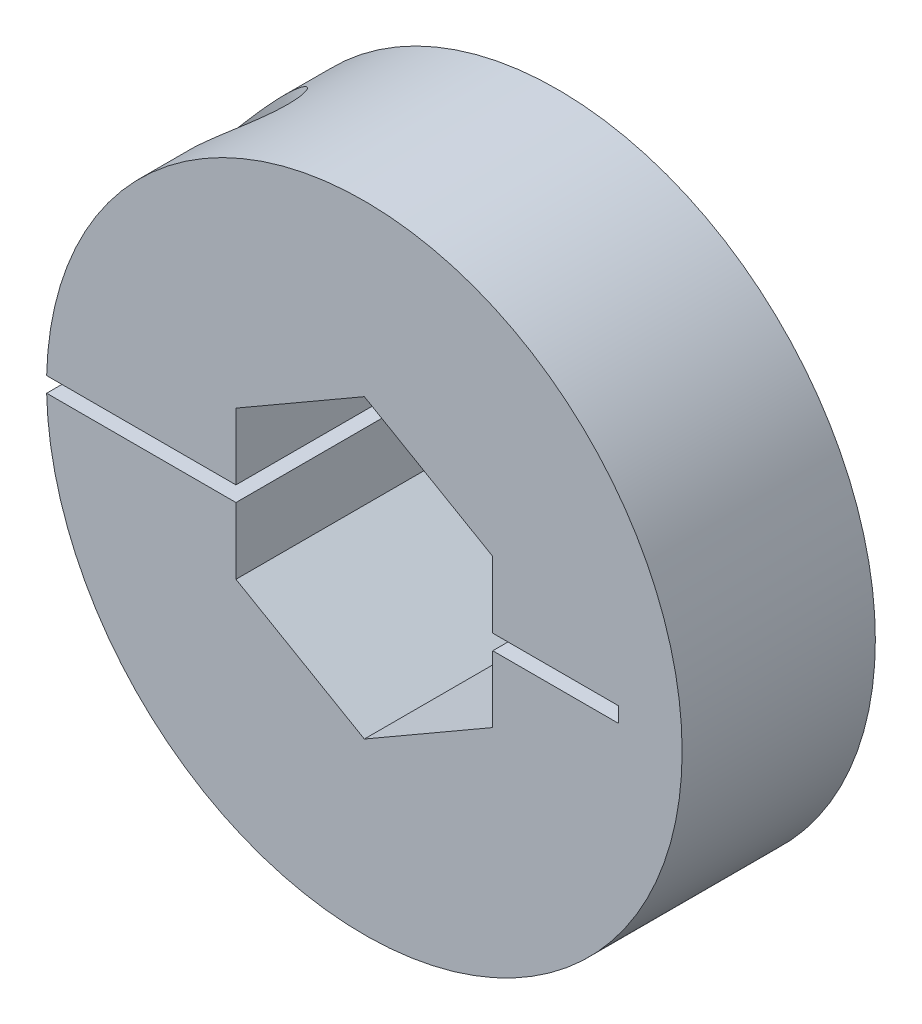
ISO-10303-21;
HEADER;
FILE_DESCRIPTION(('STEP AP214'),'2;1');
FILE_NAME('part.step','',(''),(''),'','','');
FILE_SCHEMA(('AUTOMOTIVE_DESIGN { 1 0 10303 214 1 1 1 1 }'));
ENDSEC;
DATA;
#1=APPLICATION_CONTEXT('core data for automotive mechanical design processes');
#2=APPLICATION_PROTOCOL_DEFINITION('international standard','automotive_design',2000,#1);
#3=PRODUCT_CONTEXT('',#1,'mechanical');
#4=PRODUCT('Part','Part','',(#3));
#5=PRODUCT_RELATED_PRODUCT_CATEGORY('part','',(#4));
#6=PRODUCT_DEFINITION_FORMATION('','',#4);
#7=PRODUCT_DEFINITION_CONTEXT('part definition',#1,'design');
#8=PRODUCT_DEFINITION('design','',#6,#7);
#9=PRODUCT_DEFINITION_SHAPE('','',#8);
#10=(LENGTH_UNIT() NAMED_UNIT(*) SI_UNIT(.MILLI.,.METRE.));
#11=(NAMED_UNIT(*) PLANE_ANGLE_UNIT() SI_UNIT($,.RADIAN.));
#12=(NAMED_UNIT(*) SI_UNIT($,.STERADIAN.) SOLID_ANGLE_UNIT());
#13=UNCERTAINTY_MEASURE_WITH_UNIT(LENGTH_MEASURE(1.E-05),#10,'distance_accuracy_value','');
#14=(GEOMETRIC_REPRESENTATION_CONTEXT(3) GLOBAL_UNCERTAINTY_ASSIGNED_CONTEXT((#13)) GLOBAL_UNIT_ASSIGNED_CONTEXT((#10,
#11,#12)) REPRESENTATION_CONTEXT('',''));
#15=CARTESIAN_POINT('',(0.,0.,0.));
#16=DIRECTION('',(0.,0.,1.));
#17=DIRECTION('',(1.,0.,0.));
#18=AXIS2_PLACEMENT_3D('',#15,#16,#17);
#19=CARTESIAN_POINT('',(6.4135,3.70283595144766,-4.826));
#20=DIRECTION('',(1.,0.,0.));
#21=DIRECTION('',(0.,1.,0.));
#22=AXIS2_PLACEMENT_3D('',#19,#20,#21);
#23=PLANE('',#22);
#24=DIRECTION('',(0.,1.,0.));
#25=VECTOR('',#24,1.);
#26=CARTESIAN_POINT('',(6.4135,3.70283595144766,4.826));
#27=LINE('',#26,#25);
#28=CARTESIAN_POINT('',(6.4135,-3.70283595144766,4.826));
#29=VERTEX_POINT('',#28);
#30=CARTESIAN_POINT('',(6.4135,-0.381,4.826));
#31=VERTEX_POINT('',#30);
#32=EDGE_CURVE('E220',#29,#31,#27,.T.);
#33=ORIENTED_EDGE('',*,*,#32,.T.);
#34=DIRECTION('',(0.,0.,-1.));
#35=VECTOR('',#34,1.);
#36=CARTESIAN_POINT('',(6.4135,-0.381,-4.826));
#37=LINE('',#36,#35);
#38=CARTESIAN_POINT('',(6.4135,-0.381,-4.826));
#39=VERTEX_POINT('',#38);
#40=EDGE_CURVE('E183',#31,#39,#37,.T.);
#41=ORIENTED_EDGE('',*,*,#40,.T.);
#42=DIRECTION('',(0.,1.,0.));
#43=VECTOR('',#42,1.);
#44=CARTESIAN_POINT('',(6.4135,3.70283595144766,-4.826));
#45=LINE('',#44,#43);
#46=CARTESIAN_POINT('',(6.4135,-3.70283595144766,-4.826));
#47=VERTEX_POINT('',#46);
#48=EDGE_CURVE('E202',#47,#39,#45,.T.);
#49=ORIENTED_EDGE('',*,*,#48,.F.);
#50=DIRECTION('',(0.,0.,1.));
#51=VECTOR('',#50,1.);
#52=CARTESIAN_POINT('',(6.4135,-3.70283595144766,-4.826));
#53=LINE('',#52,#51);
#54=EDGE_CURVE('E231',#47,#29,#53,.T.);
#55=ORIENTED_EDGE('',*,*,#54,.T.);
#56=EDGE_LOOP('',(#33,#41,#49,#55));
#57=FACE_BOUND('',#56,.T.);
#58=ADVANCED_FACE('F33',(#57),#23,.F.);
#59=CARTESIAN_POINT('',(-6.4135,3.70283595144767,-4.826));
#60=DIRECTION('',(-1.,0.,0.));
#61=DIRECTION('',(0.,0.,1.));
#62=AXIS2_PLACEMENT_3D('',#59,#60,#61);
#63=PLANE('',#62);
#64=DIRECTION('',(0.,-1.,0.));
#65=VECTOR('',#64,1.);
#66=CARTESIAN_POINT('',(-6.4135,3.70283595144767,-4.826));
#67=LINE('',#66,#65);
#68=CARTESIAN_POINT('',(-6.4135,-0.381,-4.826));
#69=VERTEX_POINT('',#68);
#70=CARTESIAN_POINT('',(-6.4135,-3.70283595144767,-4.826));
#71=VERTEX_POINT('',#70);
#72=EDGE_CURVE('E190',#69,#71,#67,.T.);
#73=ORIENTED_EDGE('',*,*,#72,.F.);
#74=DIRECTION('',(0.,0.,1.));
#75=VECTOR('',#74,1.);
#76=CARTESIAN_POINT('',(-6.4135,-0.381,-4.826));
#77=LINE('',#76,#75);
#78=CARTESIAN_POINT('',(-6.4135,-0.380999999999999,4.826));
#79=VERTEX_POINT('',#78);
#80=EDGE_CURVE('E11',#69,#79,#77,.T.);
#81=ORIENTED_EDGE('',*,*,#80,.T.);
#82=DIRECTION('',(0.,-1.,0.));
#83=VECTOR('',#82,1.);
#84=CARTESIAN_POINT('',(-6.4135,3.70283595144767,4.826));
#85=LINE('',#84,#83);
#86=CARTESIAN_POINT('',(-6.4135,-3.70283595144767,4.826));
#87=VERTEX_POINT('',#86);
#88=EDGE_CURVE('E209',#79,#87,#85,.T.);
#89=ORIENTED_EDGE('',*,*,#88,.T.);
#90=DIRECTION('',(0.,0.,1.));
#91=VECTOR('',#90,1.);
#92=CARTESIAN_POINT('',(-6.4135,-3.70283595144767,-4.826));
#93=LINE('',#92,#91);
#94=EDGE_CURVE('E235',#71,#87,#93,.T.);
#95=ORIENTED_EDGE('',*,*,#94,.F.);
#96=EDGE_LOOP('',(#73,#81,#89,#95));
#97=FACE_BOUND('',#96,.T.);
#98=ADVANCED_FACE('F268',(#97),#63,.F.);
#99=CARTESIAN_POINT('',(0.,0.,4.826));
#100=DIRECTION('',(0.,0.,-1.));
#101=DIRECTION('',(-1.,0.,0.));
#102=AXIS2_PLACEMENT_3D('',#99,#100,#101);
#103=CYLINDRICAL_SURFACE('',#102,15.875);
#104=CARTESIAN_POINT('',(-11.0444273414423,-11.4033437946771,2.3876));
#105=CARTESIAN_POINT('',(-10.8993451505357,-11.543860051548,2.3875989052676));
#106=CARTESIAN_POINT('',(-10.7515344815633,-11.6816220779077,2.37441386829305));
#107=CARTESIAN_POINT('',(-10.4538108643067,-11.9487784467251,2.31834079651535));
#108=CARTESIAN_POINT('',(-10.3038993530244,-12.078178198767,2.27547217874482));
#109=CARTESIAN_POINT('',(-10.0350643244456,-12.3019431103898,2.16764699043194));
#110=CARTESIAN_POINT('',(-9.91558653311282,-12.3983357041165,2.10831724106942));
#111=CARTESIAN_POINT('',(-9.68293808218132,-12.5808623037821,1.96608962689786));
#112=CARTESIAN_POINT('',(-9.56975996147336,-12.6670085888259,1.88322038373859));
#113=CARTESIAN_POINT('',(-9.37308449328351,-12.8130153213659,1.70923411588297));
#114=CARTESIAN_POINT('',(-9.2877914412731,-12.8748615574782,1.621825654732));
#115=CARTESIAN_POINT('',(-9.12899384516027,-12.987940296068,1.4307865709417));
#116=CARTESIAN_POINT('',(-9.05548644119453,-13.0391753742944,1.32715989585379));
#117=CARTESIAN_POINT('',(-8.92378937533684,-13.129663764886,1.10469067946461));
#118=CARTESIAN_POINT('',(-8.86570722780717,-13.168833267305,0.985749500272508));
#119=CARTESIAN_POINT('',(-8.76936362458115,-13.2331889273362,0.736558452506271));
#120=CARTESIAN_POINT('',(-8.73108873692553,-13.2583845619249,0.60631631765238));
#121=CARTESIAN_POINT('',(-8.68043699287462,-13.291592629371,0.355660762822259));
#122=CARTESIAN_POINT('',(-8.6654640321566,-13.3013305515726,0.235995044893112));
#123=CARTESIAN_POINT('',(-8.65380143935779,-13.3089220515833,-0.00457807721320276));
#124=CARTESIAN_POINT('',(-8.65710360499695,-13.3067809609545,-0.125484900037684));
#125=CARTESIAN_POINT('',(-8.68100163644235,-13.291200354001,-0.357182752312786));
#126=CARTESIAN_POINT('',(-8.70051380991413,-13.278468779643,-0.468136528045965));
#127=CARTESIAN_POINT('',(-8.75438596841741,-13.243012584924,-0.684684786263972));
#128=CARTESIAN_POINT('',(-8.78874571123637,-13.2202881275797,-0.790279356143626));
#129=CARTESIAN_POINT('',(-8.87157327378353,-13.1648522707911,-0.995949407419965));
#130=CARTESIAN_POINT('',(-8.92034823966629,-13.1319225957151,-1.09584139663346));
#131=CARTESIAN_POINT('',(-9.02942175633383,-13.0571640074008,-1.28544250134232));
#132=CARTESIAN_POINT('',(-9.08972341446879,-13.0153326941256,-1.37514886059104));
#133=CARTESIAN_POINT('',(-9.22566781813425,-12.9193737141598,-1.55121602525118));
#134=CARTESIAN_POINT('',(-9.30222681418438,-12.864451968125,-1.6364330271196));
#135=CARTESIAN_POINT('',(-9.46324213877241,-12.7464768518114,-1.79250884491448));
#136=CARTESIAN_POINT('',(-9.54770324535867,-12.683418552877,-1.86335889072055));
#137=CARTESIAN_POINT('',(-9.75866422529353,-12.5223094431037,-2.01766747657924));
#138=CARTESIAN_POINT('',(-9.8878487102816,-12.4207305539963,-2.09380603917316));
#139=CARTESIAN_POINT('',(-10.1505976675096,-12.2069605166467,-2.21877568529352));
#140=CARTESIAN_POINT('',(-10.2841701934636,-12.0947490503079,-2.26755320149512));
#141=CARTESIAN_POINT('',(-10.5912924900864,-11.8276311819926,-2.35109764229403));
#142=CARTESIAN_POINT('',(-10.7648144984957,-11.6700149684657,-2.37727205045803));
#143=CARTESIAN_POINT('',(-11.1053660295717,-11.3464509674141,-2.39291838369775));
#144=CARTESIAN_POINT('',(-11.2723896801656,-11.1804959413644,-2.38235785891375));
#145=CARTESIAN_POINT('',(-11.5995005779916,-10.840838089845,-2.32820477391722));
#146=CARTESIAN_POINT('',(-11.7593918016398,-10.6670475548194,-2.28397878425362));
#147=CARTESIAN_POINT('',(-11.9893690474622,-10.4059703156995,-2.19419373215372));
#148=CARTESIAN_POINT('',(-12.0644235887948,-10.3188310939867,-2.1603325126888));
#149=CARTESIAN_POINT('',(-12.2110095750511,-10.1449379801046,-2.08483056857658));
#150=CARTESIAN_POINT('',(-12.2825415227707,-10.0581840345609,-2.04319095826548));
#151=CARTESIAN_POINT('',(-12.4127571860624,-9.89688859946454,-1.95794643443098));
#152=CARTESIAN_POINT('',(-12.4719062004256,-9.82221856362842,-1.91529194708154));
#153=CARTESIAN_POINT('',(-12.5870459238989,-9.67422773907165,-1.82383311495605));
#154=CARTESIAN_POINT('',(-12.6430371808174,-9.60090671781989,-1.77502984165288));
#155=CARTESIAN_POINT('',(-12.7514615322888,-9.4564261265657,-1.67101899628634));
#156=CARTESIAN_POINT('',(-12.8039003178158,-9.38526320546854,-1.6158220705602));
#157=CARTESIAN_POINT('',(-12.9048396412539,-9.24597909686066,-1.49849416815087));
#158=CARTESIAN_POINT('',(-12.9533425635387,-9.17785607918614,-1.4363674445878));
#159=CARTESIAN_POINT('',(-13.0511967908015,-9.03824993010729,-1.29676988408524));
#160=CARTESIAN_POINT('',(-13.0999852744137,-8.96730395619907,-1.21835438464485));
#161=CARTESIAN_POINT('',(-13.1904133604198,-8.8337476888382,-1.05091058199585));
#162=CARTESIAN_POINT('',(-13.2320605498509,-8.7711285648777,-0.961893714459065));
#163=CARTESIAN_POINT('',(-13.29754758792,-8.67142320344013,-0.793890313188883));
#164=CARTESIAN_POINT('',(-13.3232842991036,-8.63176601616349,-0.717195965318796));
#165=CARTESIAN_POINT('',(-13.3675639173486,-8.56303323989576,-0.557241429556565));
#166=CARTESIAN_POINT('',(-13.3861195694005,-8.53393890961079,-0.473993192622878));
#167=CARTESIAN_POINT('',(-13.4118614718986,-8.4934135248686,-0.317780775661923));
#168=CARTESIAN_POINT('',(-13.4204878326031,-8.47975367767716,-0.245641162793166));
#169=CARTESIAN_POINT('',(-13.4310652562908,-8.46299098497211,-0.0996687728439449));
#170=CARTESIAN_POINT('',(-13.4330212503886,-8.45988034089683,-0.0258372871599154));
#171=CARTESIAN_POINT('',(-13.4300782363735,-8.46455128806321,0.121344321467713));
#172=CARTESIAN_POINT('',(-13.4251779760998,-8.47233486892212,0.194694354025134));
#173=CARTESIAN_POINT('',(-13.4089722829895,-8.49795917601115,0.33888316130682));
#174=CARTESIAN_POINT('',(-13.3976609902744,-8.51580910311258,0.409719575476256));
#175=CARTESIAN_POINT('',(-13.3647670259738,-8.56737018449348,0.570483154914371));
#176=CARTESIAN_POINT('',(-13.3410165774359,-8.60438624146364,0.658894991365331));
#177=CARTESIAN_POINT('',(-13.2857742142548,-8.68944248943492,0.827601254619371));
#178=CARTESIAN_POINT('',(-13.2542645932818,-8.73750787795412,0.907876513974474));
#179=CARTESIAN_POINT('',(-13.1648736763294,-8.87194727860976,1.10549157848295));
#180=CARTESIAN_POINT('',(-13.1024084479393,-8.964180142299,1.21671910808383));
#181=CARTESIAN_POINT('',(-12.9666266097052,-9.15950358429322,1.42159462548618));
#182=CARTESIAN_POINT('',(-12.8932806663361,-9.26262328895141,1.51519348963833));
#183=CARTESIAN_POINT('',(-12.7529561876115,-9.45457884702388,1.67041116893888));
#184=CARTESIAN_POINT('',(-12.6874581882038,-9.54235666208081,1.7347198605707));
#185=CARTESIAN_POINT('',(-12.5515316861673,-9.72045440310965,1.85403804863832));
#186=CARTESIAN_POINT('',(-12.4811002666864,-9.81077581377221,1.90904197693834));
#187=CARTESIAN_POINT('',(-12.3358117213852,-9.99284454658647,2.01017202307488));
#188=CARTESIAN_POINT('',(-12.2609535271115,-10.0845922090093,2.05629598610257));
#189=CARTESIAN_POINT('',(-12.1072384895311,-10.2686315609174,2.13979223529998));
#190=CARTESIAN_POINT('',(-12.0283827984676,-10.3609230869364,2.17716702608792));
#191=CARTESIAN_POINT('',(-11.8070012360493,-10.6139464879671,2.26764828903136));
#192=CARTESIAN_POINT('',(-11.6606570493337,-10.7746360552377,2.31184311682706));
#193=CARTESIAN_POINT('',(-11.358768286654,-11.0924295286074,2.37180645959946));
#194=CARTESIAN_POINT('',(-11.2032323352987,-11.249536610145,2.3876011982792));
#195=CARTESIAN_POINT('',(-11.0444273414423,-11.4033437946771,2.3876));
#196=B_SPLINE_CURVE_WITH_KNOTS('',3,(#104,#105,#106,#107,#108,#109,#110,#111,#112,#113,#114,
#115,#116,#117,#118,#119,#120,#121,#122,#123,#124,#125,#126,#127,#128,#129,#130,#131,#132,#133,
#134,#135,#136,#137,#138,#139,#140,#141,#142,#143,#144,#145,#146,#147,#148,#149,#150,#151,#152,
#153,#154,#155,#156,#157,#158,#159,#160,#161,#162,#163,#164,#165,#166,#167,#168,#169,#170,#171,
#172,#173,#174,#175,#176,#177,#178,#179,#180,#181,#182,#183,#184,#185,#186,#187,#188,#189,#190,
#191,#192,#193,#194,#195),.UNSPECIFIED.,.T.,.F.,(4,2,2,2,2,2,2,2,2,2,2,2,2,2,2,2,2,2,2,2,2,2,2,
2,2,2,2,2,2,2,2,2,2,2,2,2,2,2,2,2,2,2,2,2,2,4),(0.,0.605435347381356,1.21047503272589,
1.70241513283875,2.19375962515619,2.60277581078964,3.01169259531025,3.42338887957656,
3.83480561189418,4.1958746314873,4.55678160848148,4.89533703321727,5.23388693521216,
5.58024610019457,5.92669876823263,6.30634171684779,6.68621572048135,7.22658560878813,
7.76800977086947,8.47185320583411,9.17631853981218,9.89437670471053,10.2538030341663,
10.613177911459,10.9260810716737,11.2389297813438,11.5512648459972,11.8634092608956,
12.2120188121244,12.560255668233,12.8296480263265,13.0985600480953,13.3193636039075,
13.5400038937432,13.7606844844737,13.9815671100091,14.2761416089369,14.5713946557905,
15.0410339398438,15.5119631506527,15.8924900843375,16.2732439326949,16.6540900584958,
17.0348270261049,17.6981411242437,18.3608424249373),.UNSPECIFIED.);
#197=CARTESIAN_POINT('',(-11.0444273414423,-11.4033437946771,2.3876));
#198=VERTEX_POINT('',#197);
#199=EDGE_CURVE('E164',#198,#198,#196,.T.);
#200=ORIENTED_EDGE('',*,*,#199,.T.);
#201=EDGE_LOOP('',(#200));
#202=FACE_BOUND('',#201,.T.);
#203=CARTESIAN_POINT('',(-11.0444273414423,11.4033437946771,2.3876));
#204=CARTESIAN_POINT('',(-11.1410316461413,11.3097796046519,2.38760067248383));
#205=CARTESIAN_POINT('',(-11.2364562781915,11.2149733252552,2.3817424770304));
#206=CARTESIAN_POINT('',(-11.4242370014177,11.023630050328,2.35909454430029));
#207=CARTESIAN_POINT('',(-11.5165921111914,10.9270925161755,2.3423013455059));
#208=CARTESIAN_POINT('',(-11.6981879919775,10.7324662343098,2.29826190152145));
#209=CARTESIAN_POINT('',(-11.7874090083827,10.6343718952629,2.27095909064322));
#210=CARTESIAN_POINT('',(-11.9617397314798,10.4378950481063,2.20631225299437));
#211=CARTESIAN_POINT('',(-12.0468505097857,10.3395126222785,2.16897086031944));
#212=CARTESIAN_POINT('',(-12.2138743909601,10.1416917165955,2.08373615544421));
#213=CARTESIAN_POINT('',(-12.2957173273819,10.04226055715,2.03568801100375));
#214=CARTESIAN_POINT('',(-12.4543661945149,9.84481729901826,1.92920746223566));
#215=CARTESIAN_POINT('',(-12.5311693102127,9.74680601682781,1.87076932099704));
#216=CARTESIAN_POINT('',(-12.6786690846604,9.55414081553677,1.74336902150147));
#217=CARTESIAN_POINT('',(-12.7493981375568,9.45947090846535,1.67446892571527));
#218=CARTESIAN_POINT('',(-12.8842878846773,9.27489967175566,1.52501631553011));
#219=CARTESIAN_POINT('',(-12.9484578948686,9.18499166871059,1.44448073129507));
#220=CARTESIAN_POINT('',(-13.0555236854116,9.03192281128205,1.28954026023796));
#221=CARTESIAN_POINT('',(-13.0999834386435,8.96724844987656,1.21772844936183));
#222=CARTESIAN_POINT('',(-13.1830351566597,8.8446979211221,1.06514783384315));
#223=CARTESIAN_POINT('',(-13.2216214644357,8.78682831982609,0.98437052191682));
#224=CARTESIAN_POINT('',(-13.2916642619494,8.68051780445113,0.811999957899926));
#225=CARTESIAN_POINT('',(-13.3230115301261,8.63222271254298,0.720269202748668));
#226=CARTESIAN_POINT('',(-13.3751566325541,8.5512087395775,0.527434730200932));
#227=CARTESIAN_POINT('',(-13.3959951073536,8.51842988340769,0.426368937665101));
#228=CARTESIAN_POINT('',(-13.4198488900188,8.48077848523743,0.251287033722013));
#229=CARTESIAN_POINT('',(-13.4264321387893,8.47033496787661,0.178950670001411));
#230=CARTESIAN_POINT('',(-13.4329062592444,8.46006493323955,0.0332289259951278));
#231=CARTESIAN_POINT('',(-13.4328008312201,8.46023254570361,-0.0401558518234991));
#232=CARTESIAN_POINT('',(-13.425910445725,8.47116221546387,-0.185682813802213));
#233=CARTESIAN_POINT('',(-13.419134624153,8.48190978225132,-0.257826560200853));
#234=CARTESIAN_POINT('',(-13.3995057000557,8.51288445616454,-0.399183983802152));
#235=CARTESIAN_POINT('',(-13.3866470234658,8.53312025774714,-0.468394909984438));
#236=CARTESIAN_POINT('',(-13.3493609647288,8.59137991576691,-0.630378982857249));
#237=CARTESIAN_POINT('',(-13.3223508978597,8.63329646549252,-0.721143445743683));
#238=CARTESIAN_POINT('',(-13.2603590666628,8.72821357552789,-0.893724965254069));
#239=CARTESIAN_POINT('',(-13.2253570379796,8.78124228313201,-0.975518481042256));
#240=CARTESIAN_POINT('',(-13.1564812118164,8.88401385966113,-1.11567750371696));
#241=CARTESIAN_POINT('',(-13.1236601184065,8.93246185921826,-1.17553938411022));
#242=CARTESIAN_POINT('',(-13.0546389396401,9.03303725570993,-1.29001932377449));
#243=CARTESIAN_POINT('',(-13.0184367576009,9.08516693077698,-1.34463408604473));
#244=CARTESIAN_POINT('',(-12.9053867847603,9.24573783688205,-1.50137323803577));
#245=CARTESIAN_POINT('',(-12.8241751400272,9.35824082954009,-1.59623794959851));
#246=CARTESIAN_POINT('',(-12.6710339052018,9.56417192721049,-1.75039925256529));
#247=CARTESIAN_POINT('',(-12.6008374734543,9.65652947217527,-1.81296292826809));
#248=CARTESIAN_POINT('',(-12.4553762527228,9.84343600704504,-1.92833569088502));
#249=CARTESIAN_POINT('',(-12.3801088129358,9.9379861258869,-1.98113962118186));
#250=CARTESIAN_POINT('',(-12.2249595417224,10.1282320356016,-2.07733346622063));
#251=CARTESIAN_POINT('',(-12.145073263803,10.2239288577124,-2.12071411159657));
#252=CARTESIAN_POINT('',(-11.9811505030131,10.4155436829009,-2.19804291526823));
#253=CARTESIAN_POINT('',(-11.8971148046089,10.511461640928,-2.23199284850162));
#254=CARTESIAN_POINT('',(-11.7231927468596,10.7051257518904,-2.29096987912484));
#255=CARTESIAN_POINT('',(-11.6332144416284,10.8028606324078,-2.31576365253099));
#256=CARTESIAN_POINT('',(-11.4497211761295,10.9971527452777,-2.35481855263971));
#257=CARTESIAN_POINT('',(-11.3562056266875,11.0937097778706,-2.36907791650572));
#258=CARTESIAN_POINT('',(-11.1663739181875,11.2847600255464,-2.38638397693894));
#259=CARTESIAN_POINT('',(-11.0700629391119,11.3792565524783,-2.38945022532354));
#260=CARTESIAN_POINT('',(-10.875292496572,11.5655440521861,-2.38359314427958));
#261=CARTESIAN_POINT('',(-10.7768340012307,11.6573362019768,-2.37467511191319));
#262=CARTESIAN_POINT('',(-10.5388842791197,11.8736109906371,-2.33769332906401));
#263=CARTESIAN_POINT('',(-10.3987743665321,11.996438777355,-2.30338515787864));
#264=CARTESIAN_POINT('',(-10.1201952311283,12.2323537406607,-2.20638157625627));
#265=CARTESIAN_POINT('',(-9.98172413085557,12.3454532349677,-2.14372271170877));
#266=CARTESIAN_POINT('',(-9.73846457066729,12.5378290132851,-2.00270627843542));
#267=CARTESIAN_POINT('',(-9.63236459861413,12.6194046413293,-1.92977521758866));
#268=CARTESIAN_POINT('',(-9.42915218237515,12.77195369416,-1.76315862622886));
#269=CARTESIAN_POINT('',(-9.33203046267816,12.8429381084623,-1.66949486236811));
#270=CARTESIAN_POINT('',(-9.16570272592257,12.9620350840645,-1.47801696423509));
#271=CARTESIAN_POINT('',(-9.0945024361478,13.0119870988661,-1.38308585192071));
#272=CARTESIAN_POINT('',(-8.96535100360757,13.101308245414,-1.18005363637076));
#273=CARTESIAN_POINT('',(-8.90739598472089,13.1406804738433,-1.07195640032622));
#274=CARTESIAN_POINT('',(-8.80765629081024,13.207743070963,-0.844391139023691));
#275=CARTESIAN_POINT('',(-8.76595746397111,13.2353714885757,-0.724866789327103));
#276=CARTESIAN_POINT('',(-8.70182363300915,13.2776276537601,-0.478550832918037));
#277=CARTESIAN_POINT('',(-8.67938048485761,13.292260897624,-0.351762322750186));
#278=CARTESIAN_POINT('',(-8.65642209589391,13.3072213029478,-0.107781304877484));
#279=CARTESIAN_POINT('',(-8.65400422280808,13.3087898523655,0.00916025322587106));
#280=CARTESIAN_POINT('',(-8.66624640248476,13.3008215378329,0.241738905163049));
#281=CARTESIAN_POINT('',(-8.68090166636704,13.2912877879901,0.357376355604685));
#282=CARTESIAN_POINT('',(-8.72573771633806,13.2618929491555,0.580390765074984));
#283=CARTESIAN_POINT('',(-8.75542102392835,13.242362567187,0.687912809483527));
#284=CARTESIAN_POINT('',(-8.8285254586362,13.1937363531658,0.895860264014119));
#285=CARTESIAN_POINT('',(-8.87194825264839,13.1646393604611,0.996284811247938));
#286=CARTESIAN_POINT('',(-8.97294809532153,13.096019066297,1.19263737912492));
#287=CARTESIAN_POINT('',(-9.0311110782032,13.0560573129501,1.28810880752952));
#288=CARTESIAN_POINT('',(-9.1577922146444,12.9675146366661,1.46741549919269));
#289=CARTESIAN_POINT('',(-9.22631309106245,12.9189314467603,1.55124769160653));
#290=CARTESIAN_POINT('',(-9.37975104124239,12.8080384878331,1.71568699685685));
#291=CARTESIAN_POINT('',(-9.46564885702193,12.7447846064418,1.79473755429893));
#292=CARTESIAN_POINT('',(-9.64401553145633,12.6103574175,1.93714672620096));
#293=CARTESIAN_POINT('',(-9.73649088501933,12.5391762418877,2.00048954548492));
#294=CARTESIAN_POINT('',(-9.96924313273723,12.355593753456,2.13785176215065));
#295=CARTESIAN_POINT('',(-10.1117346654255,12.2394277334055,2.20311726360427));
#296=CARTESIAN_POINT('',(-10.3983748230972,11.9968654828463,2.30355542251991));
#297=CARTESIAN_POINT('',(-10.5425242286194,11.8704642489173,2.33871326364249));
#298=CARTESIAN_POINT('',(-10.7457786645904,11.6854875223026,2.36963854128551));
#299=CARTESIAN_POINT('',(-10.8060487910855,11.6297766424017,2.37643038936578));
#300=CARTESIAN_POINT('',(-10.9258349047753,11.5173123985495,2.38540820124031));
#301=CARTESIAN_POINT('',(-10.9853516976995,11.460560341851,2.38759958876144));
#302=CARTESIAN_POINT('',(-11.0444273414423,11.4033437946771,2.3876));
#303=B_SPLINE_CURVE_WITH_KNOTS('',3,(#203,#204,#205,#206,#207,#208,#209,#210,#211,#212,#213,
#214,#215,#216,#217,#218,#219,#220,#221,#222,#223,#224,#225,#226,#227,#228,#229,#230,#231,#232,
#233,#234,#235,#236,#237,#238,#239,#240,#241,#242,#243,#244,#245,#246,#247,#248,#249,#250,#251,
#252,#253,#254,#255,#256,#257,#258,#259,#260,#261,#262,#263,#264,#265,#266,#267,#268,#269,#270,
#271,#272,#273,#274,#275,#276,#277,#278,#279,#280,#281,#282,#283,#284,#285,#286,#287,#288,#289,
#290,#291,#292,#293,#294,#295,#296,#297,#298,#299,#300,#301,#302),.UNSPECIFIED.,.T.,.F.,(4,2,2,
2,2,2,2,2,2,2,2,2,2,2,2,2,2,2,2,2,2,2,2,2,2,2,2,2,2,2,2,2,2,2,2,2,2,2,2,2,2,2,2,2,2,2,2,2,2,4),
(0.,0.403370549594315,0.806868849815943,1.2125699634261,1.61816472593327,2.03005694832658,
2.44217731028098,2.85194207104009,3.26111650050435,3.57966200044844,3.89851239212203,
4.22189811810503,4.5440234384859,4.76318425209967,4.98222382323844,5.200963810379,
5.41990463079629,5.72884049052679,6.03856855999469,6.28935944593403,6.54030689836247,
7.04282877617177,7.43780407748328,7.83298747339582,8.22855785497257,8.62405373642707,
9.02902730388273,9.43406862459972,9.83840209112694,10.2425569006907,10.808812036935,
11.3743393039277,11.8298332852431,12.2848513060901,12.6694864171035,13.0540088232254,
13.4405352227674,13.8268980634914,14.1760737897653,14.5251515985793,14.8633633178133,
15.2016160851318,15.5563283850838,15.911134093645,16.3079410999639,16.7051455186943,
17.2872327342027,17.8696062374435,18.1165674643061,18.3632373715987),.UNSPECIFIED.);
#304=CARTESIAN_POINT('',(-11.0444273414423,11.4033437946771,2.3876));
#305=VERTEX_POINT('',#304);
#306=EDGE_CURVE('E414',#305,#305,#303,.T.);
#307=ORIENTED_EDGE('',*,*,#306,.T.);
#308=EDGE_LOOP('',(#307));
#309=FACE_BOUND('',#308,.T.);
#310=CARTESIAN_POINT('',(0.,0.,4.826));
#311=DIRECTION('',(0.,0.,1.));
#312=DIRECTION('',(1.,0.,0.));
#313=AXIS2_PLACEMENT_3D('',#310,#311,#312);
#314=CIRCLE('',#313,15.875);
#315=CARTESIAN_POINT('',(-15.8704273414423,-0.381,4.826));
#316=VERTEX_POINT('',#315);
#317=CARTESIAN_POINT('',(-15.8704273414423,0.380999999999998,4.826));
#318=VERTEX_POINT('',#317);
#319=EDGE_CURVE('E240',#316,#318,#314,.T.);
#320=ORIENTED_EDGE('',*,*,#319,.F.);
#321=DIRECTION('',(0.,0.,1.));
#322=VECTOR('',#321,1.);
#323=CARTESIAN_POINT('',(-15.8704273414423,-0.381,-4.826));
#324=LINE('',#323,#322);
#325=CARTESIAN_POINT('',(-15.8704273414423,-0.381,-4.826));
#326=VERTEX_POINT('',#325);
#327=EDGE_CURVE('E178',#326,#316,#324,.T.);
#328=ORIENTED_EDGE('',*,*,#327,.F.);
#329=CARTESIAN_POINT('',(0.,0.,-4.826));
#330=DIRECTION('',(0.,0.,1.));
#331=DIRECTION('',(1.,0.,0.));
#332=AXIS2_PLACEMENT_3D('',#329,#330,#331);
#333=CIRCLE('',#332,15.875);
#334=CARTESIAN_POINT('',(-15.8704273414423,0.380999999999998,-4.826));
#335=VERTEX_POINT('',#334);
#336=EDGE_CURVE('E227',#326,#335,#333,.T.);
#337=ORIENTED_EDGE('',*,*,#336,.T.);
#338=DIRECTION('',(0.,0.,1.));
#339=VECTOR('',#338,1.);
#340=CARTESIAN_POINT('',(-15.8704273414423,0.380999999999998,-4.826));
#341=LINE('',#340,#339);
#342=EDGE_CURVE('E145',#335,#318,#341,.T.);
#343=ORIENTED_EDGE('',*,*,#342,.T.);
#344=EDGE_LOOP('',(#320,#328,#337,#343));
#345=FACE_BOUND('',#344,.T.);
#346=ADVANCED_FACE('F35',(#202,#309,#345),#103,.T.);
#347=CARTESIAN_POINT('',(0.,0.,4.826));
#348=DIRECTION('',(0.,0.,1.));
#349=DIRECTION('',(1.,0.,0.));
#350=AXIS2_PLACEMENT_3D('',#347,#348,#349);
#351=PLANE('',#350);
#352=DIRECTION('',(1.,0.,0.));
#353=VECTOR('',#352,1.);
#354=CARTESIAN_POINT('',(-15.8704273414423,-0.381,4.826));
#355=LINE('',#354,#353);
#356=EDGE_CURVE('E159',#316,#79,#355,.T.);
#357=ORIENTED_EDGE('',*,*,#356,.F.);
#358=ORIENTED_EDGE('',*,*,#319,.T.);
#359=DIRECTION('',(-1.,0.,0.));
#360=VECTOR('',#359,1.);
#361=CARTESIAN_POINT('',(-15.8704273414423,0.381,4.826));
#362=LINE('',#361,#360);
#363=CARTESIAN_POINT('',(-6.4135,0.381,4.826));
#364=VERTEX_POINT('',#363);
#365=EDGE_CURVE('E174',#364,#318,#362,.T.);
#366=ORIENTED_EDGE('',*,*,#365,.F.);
#367=CARTESIAN_POINT('',(-6.4135,3.70283595144767,4.826));
#368=VERTEX_POINT('',#367);
#369=EDGE_CURVE('E210',#368,#364,#85,.T.);
#370=ORIENTED_EDGE('',*,*,#369,.F.);
#371=DIRECTION('',(-0.866025403784439,-0.499999999999999,0.));
#372=VECTOR('',#371,1.);
#373=CARTESIAN_POINT('',(-6.4135,3.70283595144767,4.826));
#374=LINE('',#373,#372);
#375=CARTESIAN_POINT('',(0.,7.40567190289533,4.826));
#376=VERTEX_POINT('',#375);
#377=EDGE_CURVE('E186',#376,#368,#374,.T.);
#378=ORIENTED_EDGE('',*,*,#377,.F.);
#379=DIRECTION('',(-0.866025403784438,0.5,0.));
#380=VECTOR('',#379,1.);
#381=CARTESIAN_POINT('',(0.,7.40567190289533,4.826));
#382=LINE('',#381,#380);
#383=CARTESIAN_POINT('',(6.4135,3.70283595144766,4.826));
#384=VERTEX_POINT('',#383);
#385=EDGE_CURVE('E191',#384,#376,#382,.T.);
#386=ORIENTED_EDGE('',*,*,#385,.F.);
#387=CARTESIAN_POINT('',(6.4135,0.381,4.826));
#388=VERTEX_POINT('',#387);
#389=EDGE_CURVE('E219',#388,#384,#27,.T.);
#390=ORIENTED_EDGE('',*,*,#389,.F.);
#391=CARTESIAN_POINT('',(12.7,0.381,4.826));
#392=VERTEX_POINT('',#391);
#393=EDGE_CURVE('E50',#392,#388,#362,.T.);
#394=ORIENTED_EDGE('',*,*,#393,.F.);
#395=DIRECTION('',(0.,1.,0.));
#396=VECTOR('',#395,1.);
#397=CARTESIAN_POINT('',(12.7,0.381,4.826));
#398=LINE('',#397,#396);
#399=CARTESIAN_POINT('',(12.7,-0.381,4.826));
#400=VERTEX_POINT('',#399);
#401=EDGE_CURVE('E144',#400,#392,#398,.T.);
#402=ORIENTED_EDGE('',*,*,#401,.F.);
#403=EDGE_CURVE('E161',#31,#400,#355,.T.);
#404=ORIENTED_EDGE('',*,*,#403,.F.);
#405=ORIENTED_EDGE('',*,*,#32,.F.);
#406=DIRECTION('',(0.866025403784439,0.5,0.));
#407=VECTOR('',#406,1.);
#408=CARTESIAN_POINT('',(0.,-7.40567190289533,4.826));
#409=LINE('',#408,#407);
#410=CARTESIAN_POINT('',(0.,-7.40567190289533,4.826));
#411=VERTEX_POINT('',#410);
#412=EDGE_CURVE('E216',#411,#29,#409,.T.);
#413=ORIENTED_EDGE('',*,*,#412,.F.);
#414=DIRECTION('',(0.866025403784439,-0.499999999999999,0.));
#415=VECTOR('',#414,1.);
#416=CARTESIAN_POINT('',(-6.4135,-3.70283595144767,4.826));
#417=LINE('',#416,#415);
#418=EDGE_CURVE('E213',#87,#411,#417,.T.);
#419=ORIENTED_EDGE('',*,*,#418,.F.);
#420=ORIENTED_EDGE('',*,*,#88,.F.);
#421=EDGE_LOOP('',(#357,#358,#366,#370,#378,#386,#390,#394,#402,#404,#405,#413,#419,#420));
#422=FACE_BOUND('',#421,.T.);
#423=ADVANCED_FACE('F257',(#422),#351,.T.);
#424=CARTESIAN_POINT('',(0.,0.,-4.826));
#425=DIRECTION('',(0.,0.,1.));
#426=DIRECTION('',(1.,0.,0.));
#427=AXIS2_PLACEMENT_3D('',#424,#425,#426);
#428=PLANE('',#427);
#429=ORIENTED_EDGE('',*,*,#336,.F.);
#430=DIRECTION('',(1.,0.,0.));
#431=VECTOR('',#430,1.);
#432=CARTESIAN_POINT('',(-15.8704273414423,-0.381,-4.826));
#433=LINE('',#432,#431);
#434=EDGE_CURVE('E146',#326,#69,#433,.T.);
#435=ORIENTED_EDGE('',*,*,#434,.T.);
#436=ORIENTED_EDGE('',*,*,#72,.T.);
#437=DIRECTION('',(0.866025403784439,-0.499999999999999,0.));
#438=VECTOR('',#437,1.);
#439=CARTESIAN_POINT('',(-6.4135,-3.70283595144767,-4.826));
#440=LINE('',#439,#438);
#441=CARTESIAN_POINT('',(0.,-7.40567190289533,-4.826));
#442=VERTEX_POINT('',#441);
#443=EDGE_CURVE('E195',#71,#442,#440,.T.);
#444=ORIENTED_EDGE('',*,*,#443,.T.);
#445=DIRECTION('',(0.866025403784439,0.5,0.));
#446=VECTOR('',#445,1.);
#447=CARTESIAN_POINT('',(0.,-7.40567190289533,-4.826));
#448=LINE('',#447,#446);
#449=EDGE_CURVE('E198',#442,#47,#448,.T.);
#450=ORIENTED_EDGE('',*,*,#449,.T.);
#451=ORIENTED_EDGE('',*,*,#48,.T.);
#452=CARTESIAN_POINT('',(12.7,-0.381,-4.826));
#453=VERTEX_POINT('',#452);
#454=EDGE_CURVE('E154',#39,#453,#433,.T.);
#455=ORIENTED_EDGE('',*,*,#454,.T.);
#456=DIRECTION('',(0.,1.,0.));
#457=VECTOR('',#456,1.);
#458=CARTESIAN_POINT('',(12.7,0.381,-4.826));
#459=LINE('',#458,#457);
#460=CARTESIAN_POINT('',(12.7,0.381,-4.826));
#461=VERTEX_POINT('',#460);
#462=EDGE_CURVE('E141',#453,#461,#459,.T.);
#463=ORIENTED_EDGE('',*,*,#462,.T.);
#464=DIRECTION('',(-1.,0.,0.));
#465=VECTOR('',#464,1.);
#466=CARTESIAN_POINT('',(-15.8704273414423,0.381,-4.826));
#467=LINE('',#466,#465);
#468=CARTESIAN_POINT('',(6.4135,0.381,-4.826));
#469=VERTEX_POINT('',#468);
#470=EDGE_CURVE('E149',#461,#469,#467,.T.);
#471=ORIENTED_EDGE('',*,*,#470,.T.);
#472=CARTESIAN_POINT('',(6.4135,3.70283595144766,-4.826));
#473=VERTEX_POINT('',#472);
#474=EDGE_CURVE('E201',#469,#473,#45,.T.);
#475=ORIENTED_EDGE('',*,*,#474,.T.);
#476=DIRECTION('',(-0.866025403784438,0.5,0.));
#477=VECTOR('',#476,1.);
#478=CARTESIAN_POINT('',(0.,7.40567190289533,-4.826));
#479=LINE('',#478,#477);
#480=CARTESIAN_POINT('',(0.,7.40567190289533,-4.826));
#481=VERTEX_POINT('',#480);
#482=EDGE_CURVE('E204',#473,#481,#479,.T.);
#483=ORIENTED_EDGE('',*,*,#482,.T.);
#484=DIRECTION('',(-0.866025403784439,-0.499999999999999,0.));
#485=VECTOR('',#484,1.);
#486=CARTESIAN_POINT('',(-6.4135,3.70283595144767,-4.826));
#487=LINE('',#486,#485);
#488=CARTESIAN_POINT('',(-6.4135,3.70283595144767,-4.826));
#489=VERTEX_POINT('',#488);
#490=EDGE_CURVE('E187',#481,#489,#487,.T.);
#491=ORIENTED_EDGE('',*,*,#490,.T.);
#492=CARTESIAN_POINT('',(-6.4135,0.381000000000001,-4.826));
#493=VERTEX_POINT('',#492);
#494=EDGE_CURVE('E192',#489,#493,#67,.T.);
#495=ORIENTED_EDGE('',*,*,#494,.T.);
#496=EDGE_CURVE('E58',#493,#335,#467,.T.);
#497=ORIENTED_EDGE('',*,*,#496,.T.);
#498=EDGE_LOOP('',(#429,#435,#436,#444,#450,#451,#455,#463,#471,#475,#483,#491,#495,#497));
#499=FACE_BOUND('',#498,.T.);
#500=ADVANCED_FACE('F157',(#499),#428,.F.);
#501=CARTESIAN_POINT('',(-6.4135,3.70283595144767,-4.826));
#502=DIRECTION('',(-0.499999999999999,0.866025403784439,0.));
#503=DIRECTION('',(-0.866025403784439,-0.5,0.));
#504=AXIS2_PLACEMENT_3D('',#501,#502,#503);
#505=PLANE('',#504);
#506=ORIENTED_EDGE('',*,*,#377,.T.);
#507=DIRECTION('',(0.,0.,1.));
#508=VECTOR('',#507,1.);
#509=CARTESIAN_POINT('',(-6.4135,3.70283595144767,-4.826));
#510=LINE('',#509,#508);
#511=EDGE_CURVE('E207',#489,#368,#510,.T.);
#512=ORIENTED_EDGE('',*,*,#511,.F.);
#513=ORIENTED_EDGE('',*,*,#490,.F.);
#514=DIRECTION('',(0.,0.,1.));
#515=VECTOR('',#514,1.);
#516=CARTESIAN_POINT('',(0.,7.40567190289533,-4.826));
#517=LINE('',#516,#515);
#518=EDGE_CURVE('E225',#481,#376,#517,.T.);
#519=ORIENTED_EDGE('',*,*,#518,.T.);
#520=EDGE_LOOP('',(#506,#512,#513,#519));
#521=FACE_BOUND('',#520,.T.);
#522=ADVANCED_FACE('F253',(#521),#505,.F.);
#523=CARTESIAN_POINT('',(0.,7.40567190289533,-4.826));
#524=DIRECTION('',(0.5,0.866025403784438,0.));
#525=DIRECTION('',(-0.866025403784439,0.5,0.));
#526=AXIS2_PLACEMENT_3D('',#523,#524,#525);
#527=PLANE('',#526);
#528=ORIENTED_EDGE('',*,*,#385,.T.);
#529=ORIENTED_EDGE('',*,*,#518,.F.);
#530=ORIENTED_EDGE('',*,*,#482,.F.);
#531=DIRECTION('',(0.,0.,1.));
#532=VECTOR('',#531,1.);
#533=CARTESIAN_POINT('',(6.4135,3.70283595144766,-4.826));
#534=LINE('',#533,#532);
#535=EDGE_CURVE('E228',#473,#384,#534,.T.);
#536=ORIENTED_EDGE('',*,*,#535,.T.);
#537=EDGE_LOOP('',(#528,#529,#530,#536));
#538=FACE_BOUND('',#537,.T.);
#539=ADVANCED_FACE('F288',(#538),#527,.F.);
#540=ORIENTED_EDGE('',*,*,#474,.F.);
#541=DIRECTION('',(0.,0.,1.));
#542=VECTOR('',#541,1.);
#543=CARTESIAN_POINT('',(6.4135,0.381,-4.826));
#544=LINE('',#543,#542);
#545=EDGE_CURVE('E151',#469,#388,#544,.T.);
#546=ORIENTED_EDGE('',*,*,#545,.T.);
#547=ORIENTED_EDGE('',*,*,#389,.T.);
#548=ORIENTED_EDGE('',*,*,#535,.F.);
#549=EDGE_LOOP('',(#540,#546,#547,#548));
#550=FACE_BOUND('',#549,.T.);
#551=ADVANCED_FACE('F286',(#550),#23,.F.);
#552=CARTESIAN_POINT('',(0.,-7.40567190289533,-4.826));
#553=DIRECTION('',(0.5,-0.866025403784439,0.));
#554=DIRECTION('',(0.866025403784439,0.5,0.));
#555=AXIS2_PLACEMENT_3D('',#552,#553,#554);
#556=PLANE('',#555);
#557=ORIENTED_EDGE('',*,*,#412,.T.);
#558=ORIENTED_EDGE('',*,*,#54,.F.);
#559=ORIENTED_EDGE('',*,*,#449,.F.);
#560=DIRECTION('',(0.,0.,1.));
#561=VECTOR('',#560,1.);
#562=CARTESIAN_POINT('',(0.,-7.40567190289533,-4.826));
#563=LINE('',#562,#561);
#564=EDGE_CURVE('E233',#442,#411,#563,.T.);
#565=ORIENTED_EDGE('',*,*,#564,.T.);
#566=EDGE_LOOP('',(#557,#558,#559,#565));
#567=FACE_BOUND('',#566,.T.);
#568=ADVANCED_FACE('F277',(#567),#556,.F.);
#569=CARTESIAN_POINT('',(-6.4135,-3.70283595144767,-4.826));
#570=DIRECTION('',(-0.499999999999999,-0.866025403784439,0.));
#571=DIRECTION('',(0.866025403784439,-0.5,0.));
#572=AXIS2_PLACEMENT_3D('',#569,#570,#571);
#573=PLANE('',#572);
#574=ORIENTED_EDGE('',*,*,#418,.T.);
#575=ORIENTED_EDGE('',*,*,#564,.F.);
#576=ORIENTED_EDGE('',*,*,#443,.F.);
#577=ORIENTED_EDGE('',*,*,#94,.T.);
#578=EDGE_LOOP('',(#574,#575,#576,#577));
#579=FACE_BOUND('',#578,.T.);
#580=ADVANCED_FACE('F272',(#579),#573,.F.);
#581=ORIENTED_EDGE('',*,*,#369,.T.);
#582=DIRECTION('',(0.,0.,-1.));
#583=VECTOR('',#582,1.);
#584=CARTESIAN_POINT('',(-6.4135,0.381,-4.826));
#585=LINE('',#584,#583);
#586=EDGE_CURVE('E43',#364,#493,#585,.T.);
#587=ORIENTED_EDGE('',*,*,#586,.T.);
#588=ORIENTED_EDGE('',*,*,#494,.F.);
#589=ORIENTED_EDGE('',*,*,#511,.T.);
#590=EDGE_LOOP('',(#581,#587,#588,#589));
#591=FACE_BOUND('',#590,.T.);
#592=ADVANCED_FACE('F247',(#591),#63,.F.);
#593=CARTESIAN_POINT('',(-15.8704273414423,0.381,-4.826));
#594=DIRECTION('',(0.,1.,0.));
#595=DIRECTION('',(-1.,0.,0.));
#596=AXIS2_PLACEMENT_3D('',#593,#594,#595);
#597=PLANE('',#596);
#598=CARTESIAN_POINT('',(-11.0444273414423,0.380999999999999,0.));
#599=DIRECTION('',(0.,1.,0.));
#600=DIRECTION('',(-1.,0.,0.));
#601=AXIS2_PLACEMENT_3D('',#598,#599,#600);
#602=CIRCLE('',#601,2.3876);
#603=CARTESIAN_POINT('',(-13.4320273414423,0.380999999999999,0.));
#604=VERTEX_POINT('',#603);
#605=EDGE_CURVE('E420',#604,#604,#602,.T.);
#606=ORIENTED_EDGE('',*,*,#605,.T.);
#607=EDGE_LOOP('',(#606));
#608=FACE_BOUND('',#607,.T.);
#609=ORIENTED_EDGE('',*,*,#365,.T.);
#610=ORIENTED_EDGE('',*,*,#342,.F.);
#611=ORIENTED_EDGE('',*,*,#496,.F.);
#612=ORIENTED_EDGE('',*,*,#586,.F.);
#613=EDGE_LOOP('',(#609,#610,#611,#612));
#614=FACE_BOUND('',#613,.T.);
#615=ADVANCED_FACE('F260',(#608,#614),#597,.F.);
#616=CARTESIAN_POINT('',(-15.8704273414423,-0.381,-4.826));
#617=DIRECTION('',(0.,-1.,0.));
#618=DIRECTION('',(1.,0.,0.));
#619=AXIS2_PLACEMENT_3D('',#616,#617,#618);
#620=PLANE('',#619);
#621=CARTESIAN_POINT('',(-11.0444273414423,-0.380999999999999,0.));
#622=DIRECTION('',(0.,-1.,0.));
#623=DIRECTION('',(1.,0.,0.));
#624=AXIS2_PLACEMENT_3D('',#621,#622,#623);
#625=CIRCLE('',#624,2.3876);
#626=CARTESIAN_POINT('',(-8.65682734144232,-0.380999999999999,0.));
#627=VERTEX_POINT('',#626);
#628=EDGE_CURVE('E38',#627,#627,#625,.T.);
#629=ORIENTED_EDGE('',*,*,#628,.T.);
#630=EDGE_LOOP('',(#629));
#631=FACE_BOUND('',#630,.T.);
#632=ORIENTED_EDGE('',*,*,#434,.F.);
#633=ORIENTED_EDGE('',*,*,#327,.T.);
#634=ORIENTED_EDGE('',*,*,#356,.T.);
#635=ORIENTED_EDGE('',*,*,#80,.F.);
#636=EDGE_LOOP('',(#632,#633,#634,#635));
#637=FACE_BOUND('',#636,.T.);
#638=ADVANCED_FACE('F376',(#631,#637),#620,.F.);
#639=ORIENTED_EDGE('',*,*,#403,.T.);
#640=DIRECTION('',(0.,0.,1.));
#641=VECTOR('',#640,1.);
#642=CARTESIAN_POINT('',(12.7,-0.381,-4.826));
#643=LINE('',#642,#641);
#644=EDGE_CURVE('E176',#453,#400,#643,.T.);
#645=ORIENTED_EDGE('',*,*,#644,.F.);
#646=ORIENTED_EDGE('',*,*,#454,.F.);
#647=ORIENTED_EDGE('',*,*,#40,.F.);
#648=EDGE_LOOP('',(#639,#645,#646,#647));
#649=FACE_BOUND('',#648,.T.);
#650=ADVANCED_FACE('F282',(#649),#620,.F.);
#651=ORIENTED_EDGE('',*,*,#470,.F.);
#652=DIRECTION('',(0.,0.,1.));
#653=VECTOR('',#652,1.);
#654=CARTESIAN_POINT('',(12.7,0.381,-4.826));
#655=LINE('',#654,#653);
#656=EDGE_CURVE('E136',#461,#392,#655,.T.);
#657=ORIENTED_EDGE('',*,*,#656,.T.);
#658=ORIENTED_EDGE('',*,*,#393,.T.);
#659=ORIENTED_EDGE('',*,*,#545,.F.);
#660=EDGE_LOOP('',(#651,#657,#658,#659));
#661=FACE_BOUND('',#660,.T.);
#662=ADVANCED_FACE('F150',(#661),#597,.F.);
#663=CARTESIAN_POINT('',(12.7,0.381,-4.826));
#664=DIRECTION('',(1.,0.,0.));
#665=DIRECTION('',(0.,0.,-1.));
#666=AXIS2_PLACEMENT_3D('',#663,#664,#665);
#667=PLANE('',#666);
#668=ORIENTED_EDGE('',*,*,#401,.T.);
#669=ORIENTED_EDGE('',*,*,#656,.F.);
#670=ORIENTED_EDGE('',*,*,#462,.F.);
#671=ORIENTED_EDGE('',*,*,#644,.T.);
#672=EDGE_LOOP('',(#668,#669,#670,#671));
#673=FACE_BOUND('',#672,.T.);
#674=ADVANCED_FACE('F138',(#673),#667,.F.);
#675=CARTESIAN_POINT('',(-11.0444273414423,-15.875,0.));
#676=DIRECTION('',(0.,1.,0.));
#677=DIRECTION('',(0.,0.,1.));
#678=AXIS2_PLACEMENT_3D('',#675,#676,#677);
#679=CYLINDRICAL_SURFACE('',#678,2.3876);
#680=ORIENTED_EDGE('',*,*,#628,.F.);
#681=EDGE_LOOP('',(#680));
#682=FACE_BOUND('',#681,.T.);
#683=ORIENTED_EDGE('',*,*,#199,.F.);
#684=EDGE_LOOP('',(#683));
#685=FACE_BOUND('',#684,.T.);
#686=ADVANCED_FACE('F393',(#682,#685),#679,.F.);
#687=ORIENTED_EDGE('',*,*,#605,.F.);
#688=EDGE_LOOP('',(#687));
#689=FACE_BOUND('',#688,.T.);
#690=ORIENTED_EDGE('',*,*,#306,.F.);
#691=EDGE_LOOP('',(#690));
#692=FACE_BOUND('',#691,.T.);
#693=ADVANCED_FACE('F398',(#689,#692),#679,.F.);
#694=CLOSED_SHELL('',(#58,#98,#346,#423,#500,#522,#539,#551,#568,#580,#592,#615,#638,#650,#662,
#674,#686,#693));
#695=MANIFOLD_SOLID_BREP('B2',#694);
#696=ADVANCED_BREP_SHAPE_REPRESENTATION('',(#18,#695),#14);
#697=SHAPE_DEFINITION_REPRESENTATION(#9,#696);
ENDSEC;
END-ISO-10303-21;
